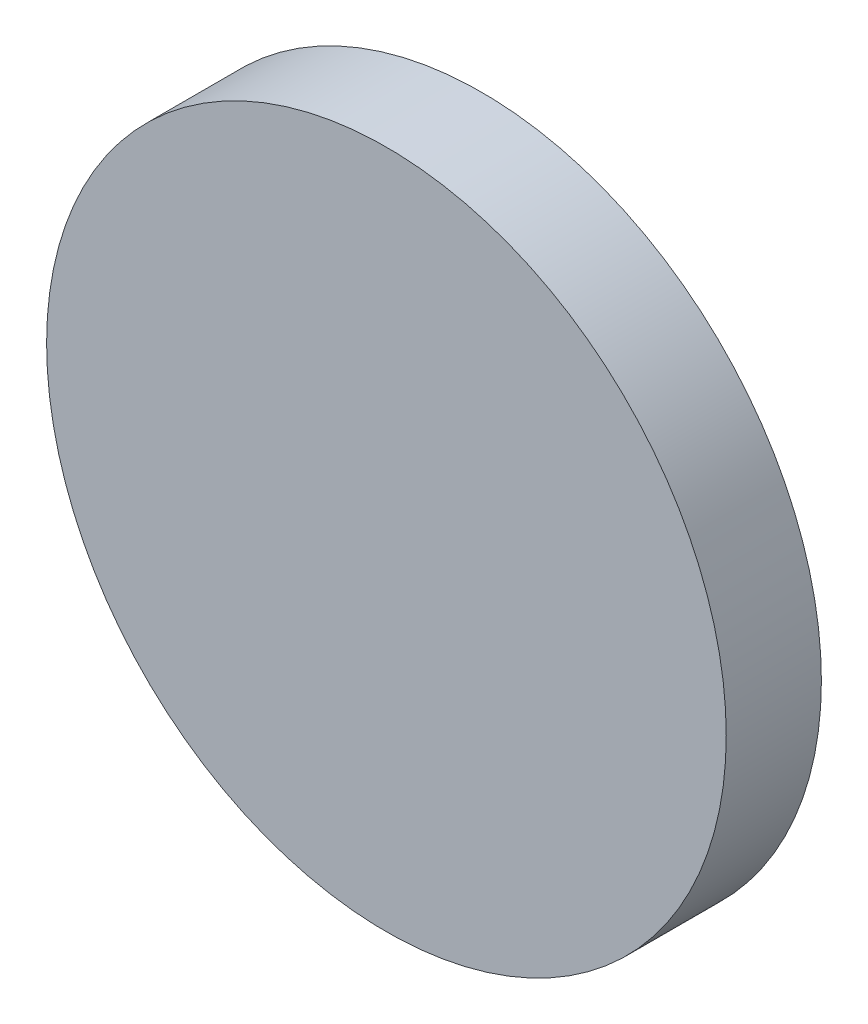
ISO-10303-21;
HEADER;
FILE_DESCRIPTION(('STEP AP214'),'2;1');
FILE_NAME('part.step','',(''),(''),'','','');
FILE_SCHEMA(('AUTOMOTIVE_DESIGN { 1 0 10303 214 1 1 1 1 }'));
ENDSEC;
DATA;
#1=APPLICATION_CONTEXT('core data for automotive mechanical design processes');
#2=APPLICATION_PROTOCOL_DEFINITION('international standard','automotive_design',2000,#1);
#3=PRODUCT_CONTEXT('',#1,'mechanical');
#4=PRODUCT('Part','Part','',(#3));
#5=PRODUCT_RELATED_PRODUCT_CATEGORY('part','',(#4));
#6=PRODUCT_DEFINITION_FORMATION('','',#4);
#7=PRODUCT_DEFINITION_CONTEXT('part definition',#1,'design');
#8=PRODUCT_DEFINITION('design','',#6,#7);
#9=PRODUCT_DEFINITION_SHAPE('','',#8);
#10=(LENGTH_UNIT() NAMED_UNIT(*) SI_UNIT(.MILLI.,.METRE.));
#11=(NAMED_UNIT(*) PLANE_ANGLE_UNIT() SI_UNIT($,.RADIAN.));
#12=(NAMED_UNIT(*) SI_UNIT($,.STERADIAN.) SOLID_ANGLE_UNIT());
#13=UNCERTAINTY_MEASURE_WITH_UNIT(LENGTH_MEASURE(1.E-05),#10,'distance_accuracy_value','');
#14=(GEOMETRIC_REPRESENTATION_CONTEXT(3) GLOBAL_UNCERTAINTY_ASSIGNED_CONTEXT((#13)) GLOBAL_UNIT_ASSIGNED_CONTEXT((#10,
#11,#12)) REPRESENTATION_CONTEXT('',''));
#15=CARTESIAN_POINT('',(0.,0.,0.));
#16=DIRECTION('',(0.,0.,1.));
#17=DIRECTION('',(1.,0.,0.));
#18=AXIS2_PLACEMENT_3D('',#15,#16,#17);
#19=CARTESIAN_POINT('',(0.,0.,7.));
#20=DIRECTION('',(0.,0.,-1.));
#21=DIRECTION('',(-1.,0.,0.));
#22=AXIS2_PLACEMENT_3D('',#19,#20,#21);
#23=CYLINDRICAL_SURFACE('',#22,25.);
#24=CARTESIAN_POINT('',(0.,0.,7.));
#25=DIRECTION('',(0.,0.,1.));
#26=DIRECTION('',(1.,0.,0.));
#27=AXIS2_PLACEMENT_3D('',#24,#25,#26);
#28=CIRCLE('',#27,25.);
#29=CARTESIAN_POINT('',(25.,0.,7.));
#30=VERTEX_POINT('',#29);
#31=EDGE_CURVE('E10',#30,#30,#28,.T.);
#32=ORIENTED_EDGE('',*,*,#31,.F.);
#33=EDGE_LOOP('',(#32));
#34=FACE_BOUND('',#33,.T.);
#35=CARTESIAN_POINT('',(0.,0.,0.));
#36=DIRECTION('',(0.,0.,1.));
#37=DIRECTION('',(1.,0.,0.));
#38=AXIS2_PLACEMENT_3D('',#35,#36,#37);
#39=CIRCLE('',#38,25.);
#40=CARTESIAN_POINT('',(25.,0.,0.));
#41=VERTEX_POINT('',#40);
#42=EDGE_CURVE('E34',#41,#41,#39,.T.);
#43=ORIENTED_EDGE('',*,*,#42,.T.);
#44=EDGE_LOOP('',(#43));
#45=FACE_BOUND('',#44,.T.);
#46=ADVANCED_FACE('F31',(#34,#45),#23,.T.);
#47=CARTESIAN_POINT('',(0.,0.,7.));
#48=DIRECTION('',(0.,0.,1.));
#49=DIRECTION('',(1.,0.,0.));
#50=AXIS2_PLACEMENT_3D('',#47,#48,#49);
#51=PLANE('',#50);
#52=ORIENTED_EDGE('',*,*,#31,.T.);
#53=EDGE_LOOP('',(#52));
#54=FACE_BOUND('',#53,.T.);
#55=ADVANCED_FACE('F60',(#54),#51,.T.);
#56=CARTESIAN_POINT('',(0.,0.,0.));
#57=DIRECTION('',(0.,0.,1.));
#58=DIRECTION('',(1.,0.,0.));
#59=AXIS2_PLACEMENT_3D('',#56,#57,#58);
#60=PLANE('',#59);
#61=CARTESIAN_POINT('',(0.,0.,0.));
#62=DIRECTION('',(0.,0.,-1.));
#63=DIRECTION('',(-1.,0.,0.));
#64=AXIS2_PLACEMENT_3D('',#61,#62,#63);
#65=CIRCLE('',#64,3.5);
#66=CARTESIAN_POINT('',(-3.5,0.,0.));
#67=VERTEX_POINT('',#66);
#68=EDGE_CURVE('E43',#67,#67,#65,.T.);
#69=ORIENTED_EDGE('',*,*,#68,.F.);
#70=EDGE_LOOP('',(#69));
#71=FACE_BOUND('',#70,.T.);
#72=ORIENTED_EDGE('',*,*,#42,.F.);
#73=EDGE_LOOP('',(#72));
#74=FACE_BOUND('',#73,.T.);
#75=ADVANCED_FACE('F54',(#71,#74),#60,.F.);
#76=CARTESIAN_POINT('',(0.,0.,5.));
#77=DIRECTION('',(0.,0.,-1.));
#78=DIRECTION('',(-1.,0.,0.));
#79=AXIS2_PLACEMENT_3D('',#76,#77,#78);
#80=CYLINDRICAL_SURFACE('',#79,3.5);
#81=CARTESIAN_POINT('',(0.,0.,5.));
#82=DIRECTION('',(0.,0.,-1.));
#83=DIRECTION('',(-1.,0.,0.));
#84=AXIS2_PLACEMENT_3D('',#81,#82,#83);
#85=CIRCLE('',#84,3.5);
#86=CARTESIAN_POINT('',(-3.5,0.,5.));
#87=VERTEX_POINT('',#86);
#88=EDGE_CURVE('E41',#87,#87,#85,.T.);
#89=ORIENTED_EDGE('',*,*,#88,.F.);
#90=EDGE_LOOP('',(#89));
#91=FACE_BOUND('',#90,.T.);
#92=ORIENTED_EDGE('',*,*,#68,.T.);
#93=EDGE_LOOP('',(#92));
#94=FACE_BOUND('',#93,.T.);
#95=ADVANCED_FACE('F51',(#91,#94),#80,.F.);
#96=CARTESIAN_POINT('',(0.,0.,5.));
#97=DIRECTION('',(0.,0.,-1.));
#98=DIRECTION('',(-1.,0.,0.));
#99=AXIS2_PLACEMENT_3D('',#96,#97,#98);
#100=PLANE('',#99);
#101=ORIENTED_EDGE('',*,*,#88,.T.);
#102=EDGE_LOOP('',(#101));
#103=FACE_BOUND('',#102,.T.);
#104=ADVANCED_FACE('F49',(#103),#100,.T.);
#105=CLOSED_SHELL('',(#46,#55,#75,#95,#104));
#106=MANIFOLD_SOLID_BREP('B2',#105);
#107=ADVANCED_BREP_SHAPE_REPRESENTATION('',(#18,#106),#14);
#108=SHAPE_DEFINITION_REPRESENTATION(#9,#107);
ENDSEC;
END-ISO-10303-21;
